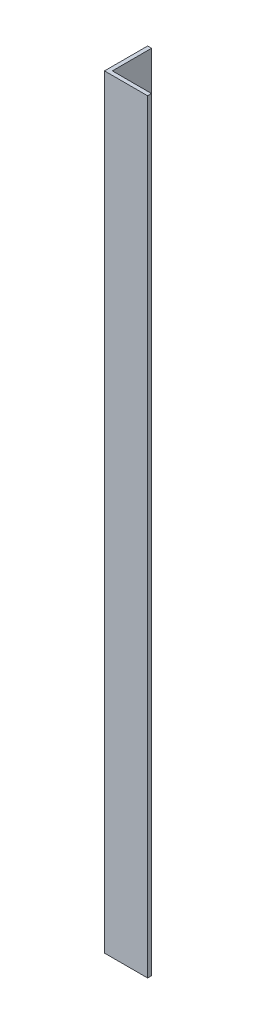
ISO-10303-21;
HEADER;
FILE_DESCRIPTION(('STEP AP214'),'2;1');
FILE_NAME('part.step','',(''),(''),'','','');
FILE_SCHEMA(('AUTOMOTIVE_DESIGN { 1 0 10303 214 1 1 1 1 }'));
ENDSEC;
DATA;
#1=APPLICATION_CONTEXT('core data for automotive mechanical design processes');
#2=APPLICATION_PROTOCOL_DEFINITION('international standard','automotive_design',2000,#1);
#3=PRODUCT_CONTEXT('',#1,'mechanical');
#4=PRODUCT('Part','Part','',(#3));
#5=PRODUCT_RELATED_PRODUCT_CATEGORY('part','',(#4));
#6=PRODUCT_DEFINITION_FORMATION('','',#4);
#7=PRODUCT_DEFINITION_CONTEXT('part definition',#1,'design');
#8=PRODUCT_DEFINITION('design','',#6,#7);
#9=PRODUCT_DEFINITION_SHAPE('','',#8);
#10=(LENGTH_UNIT() NAMED_UNIT(*) SI_UNIT(.MILLI.,.METRE.));
#11=(NAMED_UNIT(*) PLANE_ANGLE_UNIT() SI_UNIT($,.RADIAN.));
#12=(NAMED_UNIT(*) SI_UNIT($,.STERADIAN.) SOLID_ANGLE_UNIT());
#13=UNCERTAINTY_MEASURE_WITH_UNIT(LENGTH_MEASURE(1.E-05),#10,'distance_accuracy_value','');
#14=(GEOMETRIC_REPRESENTATION_CONTEXT(3) GLOBAL_UNCERTAINTY_ASSIGNED_CONTEXT((#13)) GLOBAL_UNIT_ASSIGNED_CONTEXT((#10,
#11,#12)) REPRESENTATION_CONTEXT('',''));
#15=CARTESIAN_POINT('',(0.,0.,0.));
#16=DIRECTION('',(0.,0.,1.));
#17=DIRECTION('',(1.,0.,0.));
#18=AXIS2_PLACEMENT_3D('',#15,#16,#17);
#19=CARTESIAN_POINT('',(-2.,390.,1.07187339486148));
#20=DIRECTION('',(0.,0.,1.));
#21=DIRECTION('',(1.,0.,0.));
#22=AXIS2_PLACEMENT_3D('',#19,#20,#21);
#23=PLANE('',#22);
#24=DIRECTION('',(-1.,0.,0.));
#25=VECTOR('',#24,1.);
#26=CARTESIAN_POINT('',(-2.,0.,1.07187339486148));
#27=LINE('',#26,#25);
#28=CARTESIAN_POINT('',(0.,0.,1.07187339486148));
#29=VERTEX_POINT('',#28);
#30=CARTESIAN_POINT('',(-2.,0.,1.07187339486148));
#31=VERTEX_POINT('',#30);
#32=EDGE_CURVE('E116',#29,#31,#27,.T.);
#33=ORIENTED_EDGE('',*,*,#32,.T.);
#34=DIRECTION('',(0.,-1.,0.));
#35=VECTOR('',#34,1.);
#36=CARTESIAN_POINT('',(-2.,390.,1.07187339486148));
#37=LINE('',#36,#35);
#38=CARTESIAN_POINT('',(-2.,390.,1.07187339486148));
#39=VERTEX_POINT('',#38);
#40=EDGE_CURVE('E11',#39,#31,#37,.T.);
#41=ORIENTED_EDGE('',*,*,#40,.F.);
#42=DIRECTION('',(-1.,0.,0.));
#43=VECTOR('',#42,1.);
#44=CARTESIAN_POINT('',(-2.,390.,1.07187339486148));
#45=LINE('',#44,#43);
#46=CARTESIAN_POINT('',(0.,390.,1.07187339486148));
#47=VERTEX_POINT('',#46);
#48=EDGE_CURVE('E126',#47,#39,#45,.T.);
#49=ORIENTED_EDGE('',*,*,#48,.F.);
#50=DIRECTION('',(0.,-1.,0.));
#51=VECTOR('',#50,1.);
#52=CARTESIAN_POINT('',(0.,390.,1.07187339486148));
#53=LINE('',#52,#51);
#54=EDGE_CURVE('E112',#47,#29,#53,.T.);
#55=ORIENTED_EDGE('',*,*,#54,.T.);
#56=EDGE_LOOP('',(#33,#41,#49,#55));
#57=FACE_BOUND('',#56,.T.);
#58=ADVANCED_FACE('F32',(#57),#23,.F.);
#59=CARTESIAN_POINT('',(-2.,390.,23.0718733948615));
#60=DIRECTION('',(1.,0.,0.));
#61=DIRECTION('',(0.,0.,-1.));
#62=AXIS2_PLACEMENT_3D('',#59,#60,#61);
#63=PLANE('',#62);
#64=DIRECTION('',(0.,0.,1.));
#65=VECTOR('',#64,1.);
#66=CARTESIAN_POINT('',(-2.,0.,23.0718733948615));
#67=LINE('',#66,#65);
#68=CARTESIAN_POINT('',(-2.,0.,23.0718733948615));
#69=VERTEX_POINT('',#68);
#70=EDGE_CURVE('E119',#31,#69,#67,.T.);
#71=ORIENTED_EDGE('',*,*,#70,.T.);
#72=DIRECTION('',(0.,-1.,0.));
#73=VECTOR('',#72,1.);
#74=CARTESIAN_POINT('',(-2.,390.,23.0718733948615));
#75=LINE('',#74,#73);
#76=CARTESIAN_POINT('',(-2.,390.,23.0718733948615));
#77=VERTEX_POINT('',#76);
#78=EDGE_CURVE('E40',#77,#69,#75,.T.);
#79=ORIENTED_EDGE('',*,*,#78,.F.);
#80=DIRECTION('',(0.,0.,1.));
#81=VECTOR('',#80,1.);
#82=CARTESIAN_POINT('',(-2.,390.,23.0718733948615));
#83=LINE('',#82,#81);
#84=EDGE_CURVE('E85',#39,#77,#83,.T.);
#85=ORIENTED_EDGE('',*,*,#84,.F.);
#86=ORIENTED_EDGE('',*,*,#40,.T.);
#87=EDGE_LOOP('',(#71,#79,#85,#86));
#88=FACE_BOUND('',#87,.T.);
#89=ADVANCED_FACE('F150',(#88),#63,.F.);
#90=CARTESIAN_POINT('',(20.,390.,23.0718733948615));
#91=DIRECTION('',(0.,0.,-1.));
#92=DIRECTION('',(-1.,0.,0.));
#93=AXIS2_PLACEMENT_3D('',#90,#91,#92);
#94=PLANE('',#93);
#95=DIRECTION('',(1.,0.,0.));
#96=VECTOR('',#95,1.);
#97=CARTESIAN_POINT('',(20.,0.,23.0718733948615));
#98=LINE('',#97,#96);
#99=CARTESIAN_POINT('',(20.,0.,23.0718733948615));
#100=VERTEX_POINT('',#99);
#101=EDGE_CURVE('E121',#69,#100,#98,.T.);
#102=ORIENTED_EDGE('',*,*,#101,.T.);
#103=DIRECTION('',(0.,-1.,0.));
#104=VECTOR('',#103,1.);
#105=CARTESIAN_POINT('',(20.,390.,23.0718733948615));
#106=LINE('',#105,#104);
#107=CARTESIAN_POINT('',(20.,390.,23.0718733948615));
#108=VERTEX_POINT('',#107);
#109=EDGE_CURVE('E107',#108,#100,#106,.T.);
#110=ORIENTED_EDGE('',*,*,#109,.F.);
#111=DIRECTION('',(1.,0.,0.));
#112=VECTOR('',#111,1.);
#113=CARTESIAN_POINT('',(20.,390.,23.0718733948615));
#114=LINE('',#113,#112);
#115=EDGE_CURVE('E98',#77,#108,#114,.T.);
#116=ORIENTED_EDGE('',*,*,#115,.F.);
#117=ORIENTED_EDGE('',*,*,#78,.T.);
#118=EDGE_LOOP('',(#102,#110,#116,#117));
#119=FACE_BOUND('',#118,.T.);
#120=ADVANCED_FACE('F132',(#119),#94,.F.);
#121=CARTESIAN_POINT('',(20.,390.,21.0718733948615));
#122=DIRECTION('',(-1.,0.,0.));
#123=DIRECTION('',(0.,0.,1.));
#124=AXIS2_PLACEMENT_3D('',#121,#122,#123);
#125=PLANE('',#124);
#126=DIRECTION('',(0.,0.,-1.));
#127=VECTOR('',#126,1.);
#128=CARTESIAN_POINT('',(20.,0.,21.0718733948615));
#129=LINE('',#128,#127);
#130=CARTESIAN_POINT('',(20.,0.,21.0718733948615));
#131=VERTEX_POINT('',#130);
#132=EDGE_CURVE('E106',#100,#131,#129,.T.);
#133=ORIENTED_EDGE('',*,*,#132,.T.);
#134=DIRECTION('',(0.,-1.,0.));
#135=VECTOR('',#134,1.);
#136=CARTESIAN_POINT('',(20.,390.,21.0718733948615));
#137=LINE('',#136,#135);
#138=CARTESIAN_POINT('',(20.,390.,21.0718733948615));
#139=VERTEX_POINT('',#138);
#140=EDGE_CURVE('E103',#139,#131,#137,.T.);
#141=ORIENTED_EDGE('',*,*,#140,.F.);
#142=DIRECTION('',(0.,0.,-1.));
#143=VECTOR('',#142,1.);
#144=CARTESIAN_POINT('',(20.,390.,21.0718733948615));
#145=LINE('',#144,#143);
#146=EDGE_CURVE('E92',#108,#139,#145,.T.);
#147=ORIENTED_EDGE('',*,*,#146,.F.);
#148=ORIENTED_EDGE('',*,*,#109,.T.);
#149=EDGE_LOOP('',(#133,#141,#147,#148));
#150=FACE_BOUND('',#149,.T.);
#151=ADVANCED_FACE('F104',(#150),#125,.F.);
#152=CARTESIAN_POINT('',(0.,390.,21.0718733948615));
#153=DIRECTION('',(0.,0.,1.));
#154=DIRECTION('',(1.,0.,0.));
#155=AXIS2_PLACEMENT_3D('',#152,#153,#154);
#156=PLANE('',#155);
#157=DIRECTION('',(-1.,0.,0.));
#158=VECTOR('',#157,1.);
#159=CARTESIAN_POINT('',(0.,0.,21.0718733948615));
#160=LINE('',#159,#158);
#161=CARTESIAN_POINT('',(0.,0.,21.0718733948615));
#162=VERTEX_POINT('',#161);
#163=EDGE_CURVE('E71',#131,#162,#160,.T.);
#164=ORIENTED_EDGE('',*,*,#163,.T.);
#165=DIRECTION('',(0.,-1.,0.));
#166=VECTOR('',#165,1.);
#167=CARTESIAN_POINT('',(0.,390.,21.0718733948615));
#168=LINE('',#167,#166);
#169=CARTESIAN_POINT('',(0.,390.,21.0718733948615));
#170=VERTEX_POINT('',#169);
#171=EDGE_CURVE('E108',#170,#162,#168,.T.);
#172=ORIENTED_EDGE('',*,*,#171,.F.);
#173=DIRECTION('',(-1.,0.,0.));
#174=VECTOR('',#173,1.);
#175=CARTESIAN_POINT('',(0.,390.,21.0718733948615));
#176=LINE('',#175,#174);
#177=EDGE_CURVE('E96',#139,#170,#176,.T.);
#178=ORIENTED_EDGE('',*,*,#177,.F.);
#179=ORIENTED_EDGE('',*,*,#140,.T.);
#180=EDGE_LOOP('',(#164,#172,#178,#179));
#181=FACE_BOUND('',#180,.T.);
#182=ADVANCED_FACE('F110',(#181),#156,.F.);
#183=CARTESIAN_POINT('',(0.,390.,1.07187339486148));
#184=DIRECTION('',(-1.,0.,0.));
#185=DIRECTION('',(0.,0.,1.));
#186=AXIS2_PLACEMENT_3D('',#183,#184,#185);
#187=PLANE('',#186);
#188=DIRECTION('',(0.,0.,-1.));
#189=VECTOR('',#188,1.);
#190=CARTESIAN_POINT('',(0.,0.,1.07187339486148));
#191=LINE('',#190,#189);
#192=EDGE_CURVE('E77',#162,#29,#191,.T.);
#193=ORIENTED_EDGE('',*,*,#192,.T.);
#194=ORIENTED_EDGE('',*,*,#54,.F.);
#195=DIRECTION('',(0.,0.,-1.));
#196=VECTOR('',#195,1.);
#197=CARTESIAN_POINT('',(0.,390.,1.07187339486148));
#198=LINE('',#197,#196);
#199=EDGE_CURVE('E48',#170,#47,#198,.T.);
#200=ORIENTED_EDGE('',*,*,#199,.F.);
#201=ORIENTED_EDGE('',*,*,#171,.T.);
#202=EDGE_LOOP('',(#193,#194,#200,#201));
#203=FACE_BOUND('',#202,.T.);
#204=ADVANCED_FACE('F139',(#203),#187,.F.);
#205=CARTESIAN_POINT('',(0.,390.,1.07187339486148));
#206=DIRECTION('',(0.,-1.,0.));
#207=DIRECTION('',(0.,0.,-1.));
#208=AXIS2_PLACEMENT_3D('',#205,#206,#207);
#209=PLANE('',#208);
#210=ORIENTED_EDGE('',*,*,#48,.T.);
#211=ORIENTED_EDGE('',*,*,#84,.T.);
#212=ORIENTED_EDGE('',*,*,#115,.T.);
#213=ORIENTED_EDGE('',*,*,#146,.T.);
#214=ORIENTED_EDGE('',*,*,#177,.T.);
#215=ORIENTED_EDGE('',*,*,#199,.T.);
#216=EDGE_LOOP('',(#210,#211,#212,#213,#214,#215));
#217=FACE_BOUND('',#216,.T.);
#218=ADVANCED_FACE('F94',(#217),#209,.F.);
#219=CARTESIAN_POINT('',(0.,0.,1.07187339486148));
#220=DIRECTION('',(0.,-1.,0.));
#221=DIRECTION('',(0.,0.,-1.));
#222=AXIS2_PLACEMENT_3D('',#219,#220,#221);
#223=PLANE('',#222);
#224=ORIENTED_EDGE('',*,*,#32,.F.);
#225=ORIENTED_EDGE('',*,*,#192,.F.);
#226=ORIENTED_EDGE('',*,*,#163,.F.);
#227=ORIENTED_EDGE('',*,*,#132,.F.);
#228=ORIENTED_EDGE('',*,*,#101,.F.);
#229=ORIENTED_EDGE('',*,*,#70,.F.);
#230=EDGE_LOOP('',(#224,#225,#226,#227,#228,#229));
#231=FACE_BOUND('',#230,.T.);
#232=ADVANCED_FACE('F135',(#231),#223,.T.);
#233=CLOSED_SHELL('',(#58,#89,#120,#151,#182,#204,#218,#232));
#234=MANIFOLD_SOLID_BREP('B2',#233);
#235=ADVANCED_BREP_SHAPE_REPRESENTATION('',(#18,#234),#14);
#236=SHAPE_DEFINITION_REPRESENTATION(#9,#235);
ENDSEC;
END-ISO-10303-21;
